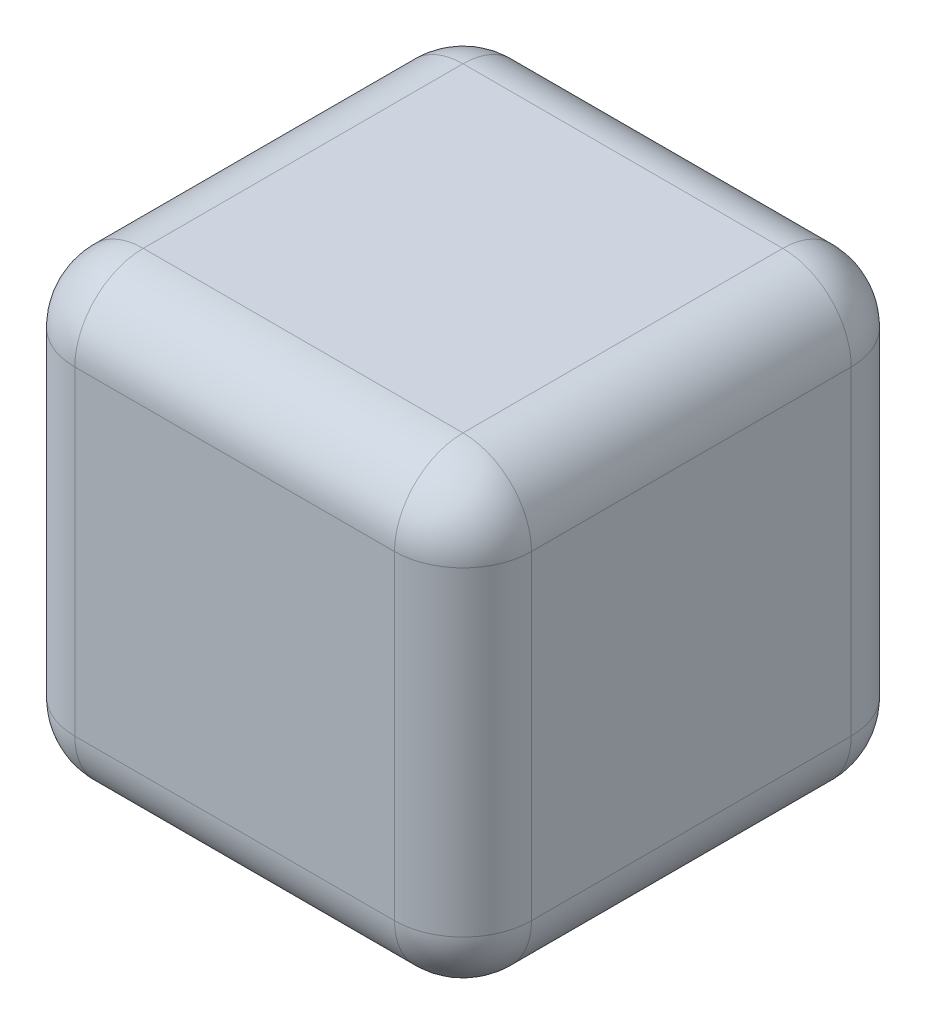
ISO-10303-21;
HEADER;
FILE_DESCRIPTION(('STEP AP214'),'2;1');
FILE_NAME('part.step','',(''),(''),'','','');
FILE_SCHEMA(('AUTOMOTIVE_DESIGN { 1 0 10303 214 1 1 1 1 }'));
ENDSEC;
DATA;
#1=APPLICATION_CONTEXT('core data for automotive mechanical design processes');
#2=APPLICATION_PROTOCOL_DEFINITION('international standard','automotive_design',2000,#1);
#3=PRODUCT_CONTEXT('',#1,'mechanical');
#4=PRODUCT('Part','Part','',(#3));
#5=PRODUCT_RELATED_PRODUCT_CATEGORY('part','',(#4));
#6=PRODUCT_DEFINITION_FORMATION('','',#4);
#7=PRODUCT_DEFINITION_CONTEXT('part definition',#1,'design');
#8=PRODUCT_DEFINITION('design','',#6,#7);
#9=PRODUCT_DEFINITION_SHAPE('','',#8);
#10=(LENGTH_UNIT() NAMED_UNIT(*) SI_UNIT(.MILLI.,.METRE.));
#11=(NAMED_UNIT(*) PLANE_ANGLE_UNIT() SI_UNIT($,.RADIAN.));
#12=(NAMED_UNIT(*) SI_UNIT($,.STERADIAN.) SOLID_ANGLE_UNIT());
#13=UNCERTAINTY_MEASURE_WITH_UNIT(LENGTH_MEASURE(1.E-05),#10,'distance_accuracy_value','');
#14=(GEOMETRIC_REPRESENTATION_CONTEXT(3) GLOBAL_UNCERTAINTY_ASSIGNED_CONTEXT((#13)) GLOBAL_UNIT_ASSIGNED_CONTEXT((#10,
#11,#12)) REPRESENTATION_CONTEXT('',''));
#15=CARTESIAN_POINT('',(0.,0.,0.));
#16=DIRECTION('',(0.,0.,1.));
#17=DIRECTION('',(1.,0.,0.));
#18=AXIS2_PLACEMENT_3D('',#15,#16,#17);
#19=CARTESIAN_POINT('',(50.,-50.,50.));
#20=DIRECTION('',(-1.,0.,0.));
#21=DIRECTION('',(0.,0.,1.));
#22=AXIS2_PLACEMENT_3D('',#19,#20,#21);
#23=PLANE('',#22);
#24=DIRECTION('',(0.,1.,0.));
#25=VECTOR('',#24,1.);
#26=CARTESIAN_POINT('',(50.,-50.,35.));
#27=LINE('',#26,#25);
#28=CARTESIAN_POINT('',(50.,35.,35.));
#29=VERTEX_POINT('',#28);
#30=CARTESIAN_POINT('',(50.,-35.,35.));
#31=VERTEX_POINT('',#30);
#32=EDGE_CURVE('E207',#29,#31,#27,.F.);
#33=ORIENTED_EDGE('',*,*,#32,.T.);
#34=DIRECTION('',(0.,0.,-1.));
#35=VECTOR('',#34,1.);
#36=CARTESIAN_POINT('',(50.,-35.,50.));
#37=LINE('',#36,#35);
#38=CARTESIAN_POINT('',(50.,-35.,-35.));
#39=VERTEX_POINT('',#38);
#40=EDGE_CURVE('E150',#31,#39,#37,.T.);
#41=ORIENTED_EDGE('',*,*,#40,.T.);
#42=DIRECTION('',(0.,1.,0.));
#43=VECTOR('',#42,1.);
#44=CARTESIAN_POINT('',(50.,50.,-35.));
#45=LINE('',#44,#43);
#46=CARTESIAN_POINT('',(50.,35.,-35.));
#47=VERTEX_POINT('',#46);
#48=EDGE_CURVE('E213',#39,#47,#45,.T.);
#49=ORIENTED_EDGE('',*,*,#48,.T.);
#50=DIRECTION('',(0.,0.,-1.));
#51=VECTOR('',#50,1.);
#52=CARTESIAN_POINT('',(50.,35.,50.));
#53=LINE('',#52,#51);
#54=EDGE_CURVE('E210',#47,#29,#53,.F.);
#55=ORIENTED_EDGE('',*,*,#54,.T.);
#56=EDGE_LOOP('',(#33,#41,#49,#55));
#57=FACE_BOUND('',#56,.T.);
#58=ADVANCED_FACE('F41',(#57),#23,.F.);
#59=CARTESIAN_POINT('',(-50.,50.,50.));
#60=DIRECTION('',(0.,-1.,0.));
#61=DIRECTION('',(0.,0.,-1.));
#62=AXIS2_PLACEMENT_3D('',#59,#60,#61);
#63=PLANE('',#62);
#64=DIRECTION('',(0.,0.,-1.));
#65=VECTOR('',#64,1.);
#66=CARTESIAN_POINT('',(35.,50.,50.));
#67=LINE('',#66,#65);
#68=CARTESIAN_POINT('',(35.,50.,35.));
#69=VERTEX_POINT('',#68);
#70=CARTESIAN_POINT('',(35.,50.,-35.));
#71=VERTEX_POINT('',#70);
#72=EDGE_CURVE('E224',#69,#71,#67,.T.);
#73=ORIENTED_EDGE('',*,*,#72,.T.);
#74=DIRECTION('',(-1.,0.,0.));
#75=VECTOR('',#74,1.);
#76=CARTESIAN_POINT('',(-50.,50.,-35.));
#77=LINE('',#76,#75);
#78=CARTESIAN_POINT('',(-35.,50.,-35.));
#79=VERTEX_POINT('',#78);
#80=EDGE_CURVE('E228',#71,#79,#77,.T.);
#81=ORIENTED_EDGE('',*,*,#80,.T.);
#82=DIRECTION('',(0.,0.,-1.));
#83=VECTOR('',#82,1.);
#84=CARTESIAN_POINT('',(-35.,50.,50.));
#85=LINE('',#84,#83);
#86=CARTESIAN_POINT('',(-35.,50.,35.));
#87=VERTEX_POINT('',#86);
#88=EDGE_CURVE('E221',#79,#87,#85,.F.);
#89=ORIENTED_EDGE('',*,*,#88,.T.);
#90=DIRECTION('',(-1.,0.,0.));
#91=VECTOR('',#90,1.);
#92=CARTESIAN_POINT('',(-50.,50.,35.));
#93=LINE('',#92,#91);
#94=EDGE_CURVE('E218',#87,#69,#93,.F.);
#95=ORIENTED_EDGE('',*,*,#94,.T.);
#96=EDGE_LOOP('',(#73,#81,#89,#95));
#97=FACE_BOUND('',#96,.T.);
#98=ADVANCED_FACE('F331',(#97),#63,.F.);
#99=CARTESIAN_POINT('',(-50.,-50.,50.));
#100=DIRECTION('',(1.,0.,0.));
#101=DIRECTION('',(0.,0.,-1.));
#102=AXIS2_PLACEMENT_3D('',#99,#100,#101);
#103=PLANE('',#102);
#104=DIRECTION('',(0.,-1.,0.));
#105=VECTOR('',#104,1.);
#106=CARTESIAN_POINT('',(-50.,-50.,-35.));
#107=LINE('',#106,#105);
#108=CARTESIAN_POINT('',(-50.,35.,-35.));
#109=VERTEX_POINT('',#108);
#110=CARTESIAN_POINT('',(-50.,-35.,-35.));
#111=VERTEX_POINT('',#110);
#112=EDGE_CURVE('E187',#109,#111,#107,.T.);
#113=ORIENTED_EDGE('',*,*,#112,.T.);
#114=DIRECTION('',(0.,0.,-1.));
#115=VECTOR('',#114,1.);
#116=CARTESIAN_POINT('',(-50.,-35.,50.));
#117=LINE('',#116,#115);
#118=CARTESIAN_POINT('',(-50.,-35.,35.));
#119=VERTEX_POINT('',#118);
#120=EDGE_CURVE('E190',#111,#119,#117,.F.);
#121=ORIENTED_EDGE('',*,*,#120,.T.);
#122=DIRECTION('',(0.,-1.,0.));
#123=VECTOR('',#122,1.);
#124=CARTESIAN_POINT('',(-50.,-50.,35.));
#125=LINE('',#124,#123);
#126=CARTESIAN_POINT('',(-50.,35.,35.));
#127=VERTEX_POINT('',#126);
#128=EDGE_CURVE('E181',#119,#127,#125,.F.);
#129=ORIENTED_EDGE('',*,*,#128,.T.);
#130=DIRECTION('',(0.,0.,-1.));
#131=VECTOR('',#130,1.);
#132=CARTESIAN_POINT('',(-50.,35.,50.));
#133=LINE('',#132,#131);
#134=EDGE_CURVE('E184',#127,#109,#133,.T.);
#135=ORIENTED_EDGE('',*,*,#134,.T.);
#136=EDGE_LOOP('',(#113,#121,#129,#135));
#137=FACE_BOUND('',#136,.T.);
#138=ADVANCED_FACE('F358',(#137),#103,.F.);
#139=CARTESIAN_POINT('',(-50.,-50.,50.));
#140=DIRECTION('',(0.,1.,0.));
#141=DIRECTION('',(0.,0.,1.));
#142=AXIS2_PLACEMENT_3D('',#139,#140,#141);
#143=PLANE('',#142);
#144=DIRECTION('',(1.,0.,0.));
#145=VECTOR('',#144,1.);
#146=CARTESIAN_POINT('',(-50.,-50.,35.));
#147=LINE('',#146,#145);
#148=CARTESIAN_POINT('',(35.,-50.,35.));
#149=VERTEX_POINT('',#148);
#150=CARTESIAN_POINT('',(-35.,-50.,35.));
#151=VERTEX_POINT('',#150);
#152=EDGE_CURVE('E135',#149,#151,#147,.F.);
#153=ORIENTED_EDGE('',*,*,#152,.T.);
#154=DIRECTION('',(0.,0.,-1.));
#155=VECTOR('',#154,1.);
#156=CARTESIAN_POINT('',(-35.,-50.,50.));
#157=LINE('',#156,#155);
#158=CARTESIAN_POINT('',(-35.,-50.,-35.));
#159=VERTEX_POINT('',#158);
#160=EDGE_CURVE('E178',#151,#159,#157,.T.);
#161=ORIENTED_EDGE('',*,*,#160,.T.);
#162=DIRECTION('',(1.,0.,0.));
#163=VECTOR('',#162,1.);
#164=CARTESIAN_POINT('',(50.,-50.,-35.));
#165=LINE('',#164,#163);
#166=CARTESIAN_POINT('',(35.,-50.,-35.));
#167=VERTEX_POINT('',#166);
#168=EDGE_CURVE('E138',#159,#167,#165,.T.);
#169=ORIENTED_EDGE('',*,*,#168,.T.);
#170=DIRECTION('',(0.,0.,-1.));
#171=VECTOR('',#170,1.);
#172=CARTESIAN_POINT('',(35.,-50.,50.));
#173=LINE('',#172,#171);
#174=EDGE_CURVE('E130',#167,#149,#173,.F.);
#175=ORIENTED_EDGE('',*,*,#174,.T.);
#176=EDGE_LOOP('',(#153,#161,#169,#175));
#177=FACE_BOUND('',#176,.T.);
#178=ADVANCED_FACE('F132',(#177),#143,.F.);
#179=CARTESIAN_POINT('',(0.,0.,50.));
#180=DIRECTION('',(0.,0.,-1.));
#181=DIRECTION('',(-1.,0.,0.));
#182=AXIS2_PLACEMENT_3D('',#179,#180,#181);
#183=PLANE('',#182);
#184=DIRECTION('',(0.,-1.,0.));
#185=VECTOR('',#184,1.);
#186=CARTESIAN_POINT('',(-35.,0.,50.));
#187=LINE('',#186,#185);
#188=CARTESIAN_POINT('',(-35.,35.,50.));
#189=VERTEX_POINT('',#188);
#190=CARTESIAN_POINT('',(-35.,-35.,50.));
#191=VERTEX_POINT('',#190);
#192=EDGE_CURVE('E51',#189,#191,#187,.T.);
#193=ORIENTED_EDGE('',*,*,#192,.T.);
#194=DIRECTION('',(1.,0.,0.));
#195=VECTOR('',#194,1.);
#196=CARTESIAN_POINT('',(0.,-35.,50.));
#197=LINE('',#196,#195);
#198=CARTESIAN_POINT('',(35.,-35.,50.));
#199=VERTEX_POINT('',#198);
#200=EDGE_CURVE('E11',#191,#199,#197,.T.);
#201=ORIENTED_EDGE('',*,*,#200,.T.);
#202=DIRECTION('',(0.,1.,0.));
#203=VECTOR('',#202,1.);
#204=CARTESIAN_POINT('',(35.,0.,50.));
#205=LINE('',#204,#203);
#206=CARTESIAN_POINT('',(35.,35.,50.));
#207=VERTEX_POINT('',#206);
#208=EDGE_CURVE('E231',#199,#207,#205,.T.);
#209=ORIENTED_EDGE('',*,*,#208,.T.);
#210=DIRECTION('',(-1.,0.,0.));
#211=VECTOR('',#210,1.);
#212=CARTESIAN_POINT('',(0.,35.,50.));
#213=LINE('',#212,#211);
#214=EDGE_CURVE('E62',#207,#189,#213,.T.);
#215=ORIENTED_EDGE('',*,*,#214,.T.);
#216=EDGE_LOOP('',(#193,#201,#209,#215));
#217=FACE_BOUND('',#216,.T.);
#218=ADVANCED_FACE('F420',(#217),#183,.F.);
#219=CARTESIAN_POINT('',(0.,0.,-50.));
#220=DIRECTION('',(0.,0.,-1.));
#221=DIRECTION('',(-1.,0.,0.));
#222=AXIS2_PLACEMENT_3D('',#219,#220,#221);
#223=PLANE('',#222);
#224=DIRECTION('',(1.,0.,0.));
#225=VECTOR('',#224,1.);
#226=CARTESIAN_POINT('',(-50.,-35.,-50.));
#227=LINE('',#226,#225);
#228=CARTESIAN_POINT('',(35.,-35.,-50.));
#229=VERTEX_POINT('',#228);
#230=CARTESIAN_POINT('',(-35.,-35.,-50.));
#231=VERTEX_POINT('',#230);
#232=EDGE_CURVE('E200',#229,#231,#227,.F.);
#233=ORIENTED_EDGE('',*,*,#232,.T.);
#234=DIRECTION('',(0.,-1.,0.));
#235=VECTOR('',#234,1.);
#236=CARTESIAN_POINT('',(-35.,50.,-50.));
#237=LINE('',#236,#235);
#238=CARTESIAN_POINT('',(-35.,35.,-50.));
#239=VERTEX_POINT('',#238);
#240=EDGE_CURVE('E203',#231,#239,#237,.F.);
#241=ORIENTED_EDGE('',*,*,#240,.T.);
#242=DIRECTION('',(-1.,0.,0.));
#243=VECTOR('',#242,1.);
#244=CARTESIAN_POINT('',(50.,35.,-50.));
#245=LINE('',#244,#243);
#246=CARTESIAN_POINT('',(35.,35.,-50.));
#247=VERTEX_POINT('',#246);
#248=EDGE_CURVE('E194',#239,#247,#245,.F.);
#249=ORIENTED_EDGE('',*,*,#248,.T.);
#250=DIRECTION('',(0.,1.,0.));
#251=VECTOR('',#250,1.);
#252=CARTESIAN_POINT('',(35.,-50.,-50.));
#253=LINE('',#252,#251);
#254=EDGE_CURVE('E197',#247,#229,#253,.F.);
#255=ORIENTED_EDGE('',*,*,#254,.T.);
#256=EDGE_LOOP('',(#233,#241,#249,#255));
#257=FACE_BOUND('',#256,.T.);
#258=ADVANCED_FACE('F322',(#257),#223,.T.);
#259=CARTESIAN_POINT('',(35.,35.,50.));
#260=DIRECTION('',(0.,0.,-1.));
#261=DIRECTION('',(-1.,0.,0.));
#262=AXIS2_PLACEMENT_3D('',#259,#260,#261);
#263=CYLINDRICAL_SURFACE('',#262,15.);
#264=CARTESIAN_POINT('',(35.,35.,35.));
#265=DIRECTION('',(0.,0.,1.));
#266=DIRECTION('',(1.,0.,0.));
#267=AXIS2_PLACEMENT_3D('',#264,#265,#266);
#268=CIRCLE('',#267,15.);
#269=EDGE_CURVE('E45',#29,#69,#268,.T.);
#270=ORIENTED_EDGE('',*,*,#269,.F.);
#271=ORIENTED_EDGE('',*,*,#54,.F.);
#272=CARTESIAN_POINT('',(35.,35.,-35.));
#273=DIRECTION('',(0.,0.,-1.));
#274=DIRECTION('',(-1.,0.,0.));
#275=AXIS2_PLACEMENT_3D('',#272,#273,#274);
#276=CIRCLE('',#275,15.);
#277=EDGE_CURVE('E174',#71,#47,#276,.T.);
#278=ORIENTED_EDGE('',*,*,#277,.F.);
#279=ORIENTED_EDGE('',*,*,#72,.F.);
#280=EDGE_LOOP('',(#270,#271,#278,#279));
#281=FACE_BOUND('',#280,.T.);
#282=ADVANCED_FACE('F43',(#281),#263,.T.);
#283=CARTESIAN_POINT('',(35.,35.,35.));
#284=DIRECTION('',(0.,0.,1.));
#285=DIRECTION('',(1.,0.,0.));
#286=AXIS2_PLACEMENT_3D('',#283,#284,#285);
#287=SPHERICAL_SURFACE('',#286,15.);
#288=CARTESIAN_POINT('',(35.,35.,35.));
#289=DIRECTION('',(0.,1.,0.));
#290=DIRECTION('',(0.,0.,1.));
#291=AXIS2_PLACEMENT_3D('',#288,#289,#290);
#292=CIRCLE('',#291,15.);
#293=EDGE_CURVE('E298',#29,#207,#292,.F.);
#294=ORIENTED_EDGE('',*,*,#293,.F.);
#295=ORIENTED_EDGE('',*,*,#269,.T.);
#296=CARTESIAN_POINT('',(35.,35.,35.));
#297=DIRECTION('',(1.,0.,0.));
#298=DIRECTION('',(0.,0.,-1.));
#299=AXIS2_PLACEMENT_3D('',#296,#297,#298);
#300=CIRCLE('',#299,15.);
#301=EDGE_CURVE('E302',#207,#69,#300,.F.);
#302=ORIENTED_EDGE('',*,*,#301,.F.);
#303=EDGE_LOOP('',(#294,#295,#302));
#304=FACE_BOUND('',#303,.T.);
#305=ADVANCED_FACE('F348',(#304),#287,.T.);
#306=CARTESIAN_POINT('',(35.,35.,-35.));
#307=DIRECTION('',(0.,0.,1.));
#308=DIRECTION('',(1.,0.,0.));
#309=AXIS2_PLACEMENT_3D('',#306,#307,#308);
#310=SPHERICAL_SURFACE('',#309,15.);
#311=CARTESIAN_POINT('',(35.,35.,-35.));
#312=DIRECTION('',(1.,0.,0.));
#313=DIRECTION('',(0.,0.,-1.));
#314=AXIS2_PLACEMENT_3D('',#311,#312,#313);
#315=CIRCLE('',#314,15.);
#316=EDGE_CURVE('E290',#71,#247,#315,.F.);
#317=ORIENTED_EDGE('',*,*,#316,.F.);
#318=ORIENTED_EDGE('',*,*,#277,.T.);
#319=CARTESIAN_POINT('',(35.,35.,-35.));
#320=DIRECTION('',(0.,1.,0.));
#321=DIRECTION('',(0.,0.,1.));
#322=AXIS2_PLACEMENT_3D('',#319,#320,#321);
#323=CIRCLE('',#322,15.);
#324=EDGE_CURVE('E294',#247,#47,#323,.F.);
#325=ORIENTED_EDGE('',*,*,#324,.F.);
#326=EDGE_LOOP('',(#317,#318,#325));
#327=FACE_BOUND('',#326,.T.);
#328=ADVANCED_FACE('F311',(#327),#310,.T.);
#329=CARTESIAN_POINT('',(0.,35.,35.));
#330=DIRECTION('',(-1.,0.,0.));
#331=DIRECTION('',(0.,0.,1.));
#332=AXIS2_PLACEMENT_3D('',#329,#330,#331);
#333=CYLINDRICAL_SURFACE('',#332,15.);
#334=ORIENTED_EDGE('',*,*,#301,.T.);
#335=ORIENTED_EDGE('',*,*,#94,.F.);
#336=CARTESIAN_POINT('',(-35.,35.,35.));
#337=DIRECTION('',(-1.,0.,0.));
#338=DIRECTION('',(0.,0.,1.));
#339=AXIS2_PLACEMENT_3D('',#336,#337,#338);
#340=CIRCLE('',#339,15.);
#341=EDGE_CURVE('E282',#189,#87,#340,.T.);
#342=ORIENTED_EDGE('',*,*,#341,.F.);
#343=ORIENTED_EDGE('',*,*,#214,.F.);
#344=EDGE_LOOP('',(#334,#335,#342,#343));
#345=FACE_BOUND('',#344,.T.);
#346=ADVANCED_FACE('F343',(#345),#333,.T.);
#347=CARTESIAN_POINT('',(35.,0.,35.));
#348=DIRECTION('',(0.,1.,0.));
#349=DIRECTION('',(0.,0.,1.));
#350=AXIS2_PLACEMENT_3D('',#347,#348,#349);
#351=CYLINDRICAL_SURFACE('',#350,15.);
#352=ORIENTED_EDGE('',*,*,#293,.T.);
#353=ORIENTED_EDGE('',*,*,#208,.F.);
#354=CARTESIAN_POINT('',(35.,-35.,35.));
#355=DIRECTION('',(0.,-1.,0.));
#356=DIRECTION('',(0.,0.,-1.));
#357=AXIS2_PLACEMENT_3D('',#354,#355,#356);
#358=CIRCLE('',#357,15.);
#359=EDGE_CURVE('E155',#31,#199,#358,.T.);
#360=ORIENTED_EDGE('',*,*,#359,.F.);
#361=ORIENTED_EDGE('',*,*,#32,.F.);
#362=EDGE_LOOP('',(#352,#353,#360,#361));
#363=FACE_BOUND('',#362,.T.);
#364=ADVANCED_FACE('F351',(#363),#351,.T.);
#365=CARTESIAN_POINT('',(35.,-35.,50.));
#366=DIRECTION('',(0.,0.,-1.));
#367=DIRECTION('',(-1.,0.,0.));
#368=AXIS2_PLACEMENT_3D('',#365,#366,#367);
#369=CYLINDRICAL_SURFACE('',#368,15.);
#370=CARTESIAN_POINT('',(35.,-35.,-35.));
#371=DIRECTION('',(0.,0.,-1.));
#372=DIRECTION('',(-1.,0.,0.));
#373=AXIS2_PLACEMENT_3D('',#370,#371,#372);
#374=CIRCLE('',#373,15.);
#375=EDGE_CURVE('E156',#39,#167,#374,.T.);
#376=ORIENTED_EDGE('',*,*,#375,.F.);
#377=ORIENTED_EDGE('',*,*,#40,.F.);
#378=CARTESIAN_POINT('',(35.,-35.,35.));
#379=DIRECTION('',(0.,0.,1.));
#380=DIRECTION('',(1.,0.,0.));
#381=AXIS2_PLACEMENT_3D('',#378,#379,#380);
#382=CIRCLE('',#381,15.);
#383=EDGE_CURVE('E146',#149,#31,#382,.T.);
#384=ORIENTED_EDGE('',*,*,#383,.F.);
#385=ORIENTED_EDGE('',*,*,#174,.F.);
#386=EDGE_LOOP('',(#376,#377,#384,#385));
#387=FACE_BOUND('',#386,.T.);
#388=ADVANCED_FACE('F148',(#387),#369,.T.);
#389=CARTESIAN_POINT('',(35.,-50.,-35.));
#390=DIRECTION('',(0.,-1.,0.));
#391=DIRECTION('',(0.,0.,-1.));
#392=AXIS2_PLACEMENT_3D('',#389,#390,#391);
#393=CYLINDRICAL_SURFACE('',#392,15.);
#394=ORIENTED_EDGE('',*,*,#324,.T.);
#395=ORIENTED_EDGE('',*,*,#48,.F.);
#396=CARTESIAN_POINT('',(35.,-35.,-35.));
#397=DIRECTION('',(0.,-1.,0.));
#398=DIRECTION('',(0.,0.,-1.));
#399=AXIS2_PLACEMENT_3D('',#396,#397,#398);
#400=CIRCLE('',#399,15.);
#401=EDGE_CURVE('E275',#229,#39,#400,.T.);
#402=ORIENTED_EDGE('',*,*,#401,.F.);
#403=ORIENTED_EDGE('',*,*,#254,.F.);
#404=EDGE_LOOP('',(#394,#395,#402,#403));
#405=FACE_BOUND('',#404,.T.);
#406=ADVANCED_FACE('F318',(#405),#393,.T.);
#407=CARTESIAN_POINT('',(-50.,35.,-35.));
#408=DIRECTION('',(1.,0.,0.));
#409=DIRECTION('',(0.,0.,-1.));
#410=AXIS2_PLACEMENT_3D('',#407,#408,#409);
#411=CYLINDRICAL_SURFACE('',#410,15.);
#412=ORIENTED_EDGE('',*,*,#316,.T.);
#413=ORIENTED_EDGE('',*,*,#248,.F.);
#414=CARTESIAN_POINT('',(-35.,35.,-35.));
#415=DIRECTION('',(-1.,0.,0.));
#416=DIRECTION('',(0.,0.,1.));
#417=AXIS2_PLACEMENT_3D('',#414,#415,#416);
#418=CIRCLE('',#417,15.);
#419=EDGE_CURVE('E271',#79,#239,#418,.T.);
#420=ORIENTED_EDGE('',*,*,#419,.F.);
#421=ORIENTED_EDGE('',*,*,#80,.F.);
#422=EDGE_LOOP('',(#412,#413,#420,#421));
#423=FACE_BOUND('',#422,.T.);
#424=ADVANCED_FACE('F328',(#423),#411,.T.);
#425=CARTESIAN_POINT('',(-35.,35.,50.));
#426=DIRECTION('',(0.,0.,-1.));
#427=DIRECTION('',(-1.,0.,0.));
#428=AXIS2_PLACEMENT_3D('',#425,#426,#427);
#429=CYLINDRICAL_SURFACE('',#428,15.);
#430=CARTESIAN_POINT('',(-35.,35.,35.));
#431=DIRECTION('',(0.,0.,1.));
#432=DIRECTION('',(1.,0.,0.));
#433=AXIS2_PLACEMENT_3D('',#430,#431,#432);
#434=CIRCLE('',#433,15.);
#435=EDGE_CURVE('E286',#87,#127,#434,.T.);
#436=ORIENTED_EDGE('',*,*,#435,.F.);
#437=ORIENTED_EDGE('',*,*,#88,.F.);
#438=CARTESIAN_POINT('',(-35.,35.,-35.));
#439=DIRECTION('',(0.,0.,-1.));
#440=DIRECTION('',(-1.,0.,0.));
#441=AXIS2_PLACEMENT_3D('',#438,#439,#440);
#442=CIRCLE('',#441,15.);
#443=EDGE_CURVE('E267',#109,#79,#442,.T.);
#444=ORIENTED_EDGE('',*,*,#443,.F.);
#445=ORIENTED_EDGE('',*,*,#134,.F.);
#446=EDGE_LOOP('',(#436,#437,#444,#445));
#447=FACE_BOUND('',#446,.T.);
#448=ADVANCED_FACE('F336',(#447),#429,.T.);
#449=CARTESIAN_POINT('',(-35.,35.,35.));
#450=DIRECTION('',(0.,0.,1.));
#451=DIRECTION('',(1.,0.,0.));
#452=AXIS2_PLACEMENT_3D('',#449,#450,#451);
#453=SPHERICAL_SURFACE('',#452,15.);
#454=ORIENTED_EDGE('',*,*,#341,.T.);
#455=ORIENTED_EDGE('',*,*,#435,.T.);
#456=CARTESIAN_POINT('',(-35.,35.,35.));
#457=DIRECTION('',(0.,1.,0.));
#458=DIRECTION('',(0.,0.,1.));
#459=AXIS2_PLACEMENT_3D('',#456,#457,#458);
#460=CIRCLE('',#459,15.);
#461=EDGE_CURVE('E163',#189,#127,#460,.F.);
#462=ORIENTED_EDGE('',*,*,#461,.F.);
#463=EDGE_LOOP('',(#454,#455,#462));
#464=FACE_BOUND('',#463,.T.);
#465=ADVANCED_FACE('F341',(#464),#453,.T.);
#466=CARTESIAN_POINT('',(35.,-35.,35.));
#467=DIRECTION('',(0.,0.,1.));
#468=DIRECTION('',(1.,0.,0.));
#469=AXIS2_PLACEMENT_3D('',#466,#467,#468);
#470=SPHERICAL_SURFACE('',#469,15.);
#471=ORIENTED_EDGE('',*,*,#383,.T.);
#472=ORIENTED_EDGE('',*,*,#359,.T.);
#473=CARTESIAN_POINT('',(35.,-35.,35.));
#474=DIRECTION('',(1.,0.,0.));
#475=DIRECTION('',(0.,0.,-1.));
#476=AXIS2_PLACEMENT_3D('',#473,#474,#475);
#477=CIRCLE('',#476,15.);
#478=EDGE_CURVE('E158',#149,#199,#477,.F.);
#479=ORIENTED_EDGE('',*,*,#478,.F.);
#480=EDGE_LOOP('',(#471,#472,#479));
#481=FACE_BOUND('',#480,.T.);
#482=ADVANCED_FACE('F159',(#481),#470,.T.);
#483=CARTESIAN_POINT('',(35.,-35.,-35.));
#484=DIRECTION('',(0.,0.,1.));
#485=DIRECTION('',(1.,0.,0.));
#486=AXIS2_PLACEMENT_3D('',#483,#484,#485);
#487=SPHERICAL_SURFACE('',#486,15.);
#488=ORIENTED_EDGE('',*,*,#401,.T.);
#489=ORIENTED_EDGE('',*,*,#375,.T.);
#490=CARTESIAN_POINT('',(35.,-35.,-35.));
#491=DIRECTION('',(1.,0.,0.));
#492=DIRECTION('',(0.,0.,-1.));
#493=AXIS2_PLACEMENT_3D('',#490,#491,#492);
#494=CIRCLE('',#493,15.);
#495=EDGE_CURVE('E164',#229,#167,#494,.F.);
#496=ORIENTED_EDGE('',*,*,#495,.F.);
#497=EDGE_LOOP('',(#488,#489,#496));
#498=FACE_BOUND('',#497,.T.);
#499=ADVANCED_FACE('F391',(#498),#487,.T.);
#500=CARTESIAN_POINT('',(-35.,35.,-35.));
#501=DIRECTION('',(0.,0.,1.));
#502=DIRECTION('',(1.,0.,0.));
#503=AXIS2_PLACEMENT_3D('',#500,#501,#502);
#504=SPHERICAL_SURFACE('',#503,15.);
#505=ORIENTED_EDGE('',*,*,#443,.T.);
#506=ORIENTED_EDGE('',*,*,#419,.T.);
#507=CARTESIAN_POINT('',(-35.,35.,-35.));
#508=DIRECTION('',(0.,1.,0.));
#509=DIRECTION('',(0.,0.,1.));
#510=AXIS2_PLACEMENT_3D('',#507,#508,#509);
#511=CIRCLE('',#510,15.);
#512=EDGE_CURVE('E258',#109,#239,#511,.F.);
#513=ORIENTED_EDGE('',*,*,#512,.F.);
#514=EDGE_LOOP('',(#505,#506,#513));
#515=FACE_BOUND('',#514,.T.);
#516=ADVANCED_FACE('F387',(#515),#504,.T.);
#517=CARTESIAN_POINT('',(-35.,0.,35.));
#518=DIRECTION('',(0.,-1.,0.));
#519=DIRECTION('',(0.,0.,-1.));
#520=AXIS2_PLACEMENT_3D('',#517,#518,#519);
#521=CYLINDRICAL_SURFACE('',#520,15.);
#522=ORIENTED_EDGE('',*,*,#461,.T.);
#523=ORIENTED_EDGE('',*,*,#128,.F.);
#524=CARTESIAN_POINT('',(-35.,-35.,35.));
#525=DIRECTION('',(0.,-1.,0.));
#526=DIRECTION('',(0.,0.,-1.));
#527=AXIS2_PLACEMENT_3D('',#524,#525,#526);
#528=CIRCLE('',#527,15.);
#529=EDGE_CURVE('E254',#191,#119,#528,.T.);
#530=ORIENTED_EDGE('',*,*,#529,.F.);
#531=ORIENTED_EDGE('',*,*,#192,.F.);
#532=EDGE_LOOP('',(#522,#523,#530,#531));
#533=FACE_BOUND('',#532,.T.);
#534=ADVANCED_FACE('F384',(#533),#521,.T.);
#535=CARTESIAN_POINT('',(0.,-35.,35.));
#536=DIRECTION('',(1.,0.,0.));
#537=DIRECTION('',(0.,0.,-1.));
#538=AXIS2_PLACEMENT_3D('',#535,#536,#537);
#539=CYLINDRICAL_SURFACE('',#538,15.);
#540=ORIENTED_EDGE('',*,*,#478,.T.);
#541=ORIENTED_EDGE('',*,*,#200,.F.);
#542=CARTESIAN_POINT('',(-35.,-35.,35.));
#543=DIRECTION('',(-1.,0.,0.));
#544=DIRECTION('',(0.,0.,1.));
#545=AXIS2_PLACEMENT_3D('',#542,#543,#544);
#546=CIRCLE('',#545,15.);
#547=EDGE_CURVE('E168',#151,#191,#546,.T.);
#548=ORIENTED_EDGE('',*,*,#547,.F.);
#549=ORIENTED_EDGE('',*,*,#152,.F.);
#550=EDGE_LOOP('',(#540,#541,#548,#549));
#551=FACE_BOUND('',#550,.T.);
#552=ADVANCED_FACE('F166',(#551),#539,.T.);
#553=CARTESIAN_POINT('',(-50.,-35.,-35.));
#554=DIRECTION('',(-1.,0.,0.));
#555=DIRECTION('',(0.,0.,1.));
#556=AXIS2_PLACEMENT_3D('',#553,#554,#555);
#557=CYLINDRICAL_SURFACE('',#556,15.);
#558=ORIENTED_EDGE('',*,*,#495,.T.);
#559=ORIENTED_EDGE('',*,*,#168,.F.);
#560=CARTESIAN_POINT('',(-35.,-35.,-35.));
#561=DIRECTION('',(-1.,0.,0.));
#562=DIRECTION('',(0.,0.,1.));
#563=AXIS2_PLACEMENT_3D('',#560,#561,#562);
#564=CIRCLE('',#563,15.);
#565=EDGE_CURVE('E248',#231,#159,#564,.T.);
#566=ORIENTED_EDGE('',*,*,#565,.F.);
#567=ORIENTED_EDGE('',*,*,#232,.F.);
#568=EDGE_LOOP('',(#558,#559,#566,#567));
#569=FACE_BOUND('',#568,.T.);
#570=ADVANCED_FACE('F377',(#569),#557,.T.);
#571=CARTESIAN_POINT('',(-35.,-50.,-35.));
#572=DIRECTION('',(0.,1.,0.));
#573=DIRECTION('',(0.,0.,1.));
#574=AXIS2_PLACEMENT_3D('',#571,#572,#573);
#575=CYLINDRICAL_SURFACE('',#574,15.);
#576=ORIENTED_EDGE('',*,*,#512,.T.);
#577=ORIENTED_EDGE('',*,*,#240,.F.);
#578=CARTESIAN_POINT('',(-35.,-35.,-35.));
#579=DIRECTION('',(0.,-1.,0.));
#580=DIRECTION('',(0.,0.,-1.));
#581=AXIS2_PLACEMENT_3D('',#578,#579,#580);
#582=CIRCLE('',#581,15.);
#583=EDGE_CURVE('E244',#111,#231,#582,.T.);
#584=ORIENTED_EDGE('',*,*,#583,.F.);
#585=ORIENTED_EDGE('',*,*,#112,.F.);
#586=EDGE_LOOP('',(#576,#577,#584,#585));
#587=FACE_BOUND('',#586,.T.);
#588=ADVANCED_FACE('F373',(#587),#575,.T.);
#589=CARTESIAN_POINT('',(-35.,-35.,35.));
#590=DIRECTION('',(0.,0.,1.));
#591=DIRECTION('',(1.,0.,0.));
#592=AXIS2_PLACEMENT_3D('',#589,#590,#591);
#593=SPHERICAL_SURFACE('',#592,15.);
#594=ORIENTED_EDGE('',*,*,#547,.T.);
#595=ORIENTED_EDGE('',*,*,#529,.T.);
#596=CARTESIAN_POINT('',(-35.,-35.,35.));
#597=DIRECTION('',(0.,0.,1.));
#598=DIRECTION('',(1.,0.,0.));
#599=AXIS2_PLACEMENT_3D('',#596,#597,#598);
#600=CIRCLE('',#599,15.);
#601=EDGE_CURVE('E241',#151,#119,#600,.F.);
#602=ORIENTED_EDGE('',*,*,#601,.F.);
#603=EDGE_LOOP('',(#594,#595,#602));
#604=FACE_BOUND('',#603,.T.);
#605=ADVANCED_FACE('F369',(#604),#593,.T.);
#606=CARTESIAN_POINT('',(-35.,-35.,-35.));
#607=DIRECTION('',(0.,0.,1.));
#608=DIRECTION('',(1.,0.,0.));
#609=AXIS2_PLACEMENT_3D('',#606,#607,#608);
#610=SPHERICAL_SURFACE('',#609,15.);
#611=ORIENTED_EDGE('',*,*,#583,.T.);
#612=ORIENTED_EDGE('',*,*,#565,.T.);
#613=CARTESIAN_POINT('',(-35.,-35.,-35.));
#614=DIRECTION('',(0.,0.,-1.));
#615=DIRECTION('',(-1.,0.,0.));
#616=AXIS2_PLACEMENT_3D('',#613,#614,#615);
#617=CIRCLE('',#616,15.);
#618=EDGE_CURVE('E238',#111,#159,#617,.F.);
#619=ORIENTED_EDGE('',*,*,#618,.F.);
#620=EDGE_LOOP('',(#611,#612,#619));
#621=FACE_BOUND('',#620,.T.);
#622=ADVANCED_FACE('F365',(#621),#610,.T.);
#623=CARTESIAN_POINT('',(-35.,-35.,50.));
#624=DIRECTION('',(0.,0.,-1.));
#625=DIRECTION('',(-1.,0.,0.));
#626=AXIS2_PLACEMENT_3D('',#623,#624,#625);
#627=CYLINDRICAL_SURFACE('',#626,15.);
#628=ORIENTED_EDGE('',*,*,#601,.T.);
#629=ORIENTED_EDGE('',*,*,#120,.F.);
#630=ORIENTED_EDGE('',*,*,#618,.T.);
#631=ORIENTED_EDGE('',*,*,#160,.F.);
#632=EDGE_LOOP('',(#628,#629,#630,#631));
#633=FACE_BOUND('',#632,.T.);
#634=ADVANCED_FACE('F362',(#633),#627,.T.);
#635=CLOSED_SHELL('',(#58,#98,#138,#178,#218,#258,#282,#305,#328,#346,#364,#388,#406,#424,#448,
#465,#482,#499,#516,#534,#552,#570,#588,#605,#622,#634));
#636=MANIFOLD_SOLID_BREP('B2',#635);
#637=ADVANCED_BREP_SHAPE_REPRESENTATION('',(#18,#636),#14);
#638=SHAPE_DEFINITION_REPRESENTATION(#9,#637);
ENDSEC;
END-ISO-10303-21;
